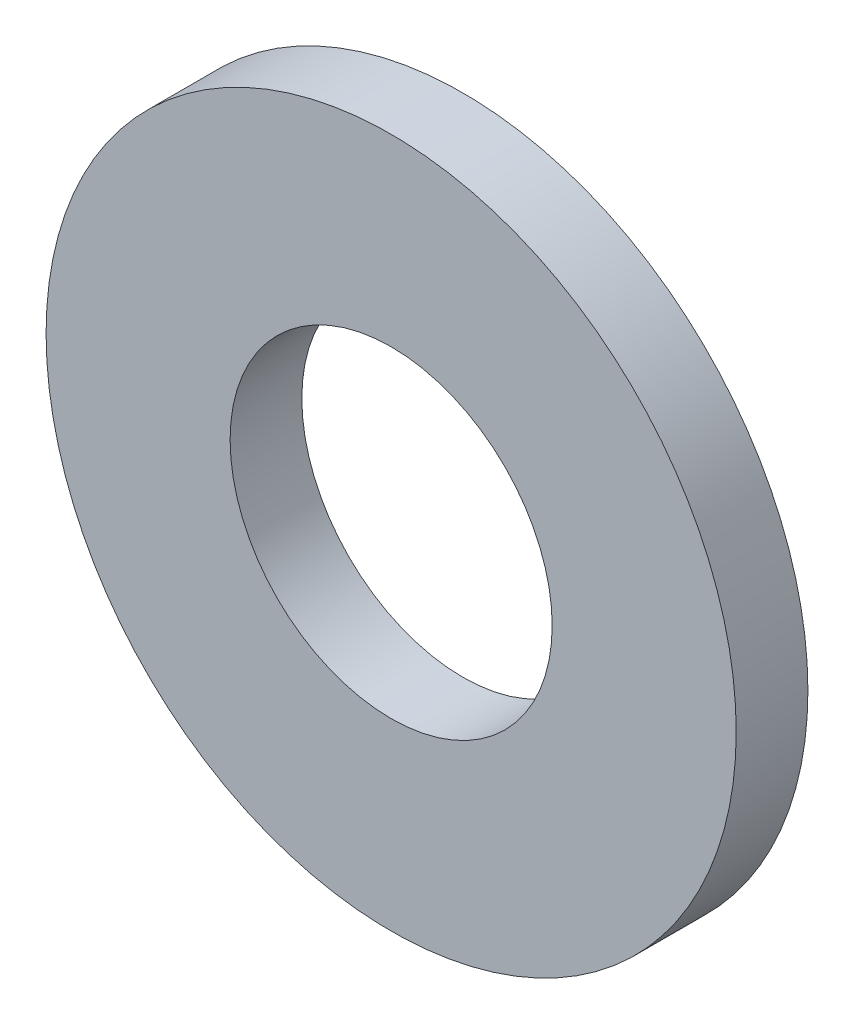
ISO-10303-21;
HEADER;
FILE_DESCRIPTION(('STEP AP214'),'2;1');
FILE_NAME('part.step','',(''),(''),'','','');
FILE_SCHEMA(('AUTOMOTIVE_DESIGN { 1 0 10303 214 1 1 1 1 }'));
ENDSEC;
DATA;
#1=APPLICATION_CONTEXT('core data for automotive mechanical design processes');
#2=APPLICATION_PROTOCOL_DEFINITION('international standard','automotive_design',2000,#1);
#3=PRODUCT_CONTEXT('',#1,'mechanical');
#4=PRODUCT('Part','Part','',(#3));
#5=PRODUCT_RELATED_PRODUCT_CATEGORY('part','',(#4));
#6=PRODUCT_DEFINITION_FORMATION('','',#4);
#7=PRODUCT_DEFINITION_CONTEXT('part definition',#1,'design');
#8=PRODUCT_DEFINITION('design','',#6,#7);
#9=PRODUCT_DEFINITION_SHAPE('','',#8);
#10=(LENGTH_UNIT() NAMED_UNIT(*) SI_UNIT(.MILLI.,.METRE.));
#11=(NAMED_UNIT(*) PLANE_ANGLE_UNIT() SI_UNIT($,.RADIAN.));
#12=(NAMED_UNIT(*) SI_UNIT($,.STERADIAN.) SOLID_ANGLE_UNIT());
#13=UNCERTAINTY_MEASURE_WITH_UNIT(LENGTH_MEASURE(1.E-05),#10,'distance_accuracy_value','');
#14=(GEOMETRIC_REPRESENTATION_CONTEXT(3) GLOBAL_UNCERTAINTY_ASSIGNED_CONTEXT((#13)) GLOBAL_UNIT_ASSIGNED_CONTEXT((#10,
#11,#12)) REPRESENTATION_CONTEXT('',''));
#15=CARTESIAN_POINT('',(0.,0.,0.));
#16=DIRECTION('',(0.,0.,1.));
#17=DIRECTION('',(1.,0.,0.));
#18=AXIS2_PLACEMENT_3D('',#15,#16,#17);
#19=CARTESIAN_POINT('',(0.,0.,-1.87));
#20=DIRECTION('',(0.,0.,1.));
#21=DIRECTION('',(1.,0.,0.));
#22=AXIS2_PLACEMENT_3D('',#19,#20,#21);
#23=CYLINDRICAL_SURFACE('',#22,9.);
#24=CARTESIAN_POINT('',(0.,0.,-1.87));
#25=DIRECTION('',(0.,0.,1.));
#26=DIRECTION('',(1.,0.,0.));
#27=AXIS2_PLACEMENT_3D('',#24,#25,#26);
#28=CIRCLE('',#27,9.);
#29=CARTESIAN_POINT('',(9.,0.,-1.87));
#30=VERTEX_POINT('',#29);
#31=EDGE_CURVE('E10',#30,#30,#28,.T.);
#32=ORIENTED_EDGE('',*,*,#31,.T.);
#33=EDGE_LOOP('',(#32));
#34=FACE_BOUND('',#33,.T.);
#35=CARTESIAN_POINT('',(0.,0.,0.));
#36=DIRECTION('',(0.,0.,1.));
#37=DIRECTION('',(1.,0.,0.));
#38=AXIS2_PLACEMENT_3D('',#35,#36,#37);
#39=CIRCLE('',#38,9.);
#40=CARTESIAN_POINT('',(9.,0.,0.));
#41=VERTEX_POINT('',#40);
#42=EDGE_CURVE('E33',#41,#41,#39,.T.);
#43=ORIENTED_EDGE('',*,*,#42,.F.);
#44=EDGE_LOOP('',(#43));
#45=FACE_BOUND('',#44,.T.);
#46=ADVANCED_FACE('F30',(#34,#45),#23,.T.);
#47=CARTESIAN_POINT('',(0.,0.,-1.87));
#48=DIRECTION('',(0.,0.,1.));
#49=DIRECTION('',(1.,0.,0.));
#50=AXIS2_PLACEMENT_3D('',#47,#48,#49);
#51=PLANE('',#50);
#52=CARTESIAN_POINT('',(0.,0.,-1.87));
#53=DIRECTION('',(0.,0.,1.));
#54=DIRECTION('',(1.,0.,0.));
#55=AXIS2_PLACEMENT_3D('',#52,#53,#54);
#56=CIRCLE('',#55,4.2);
#57=CARTESIAN_POINT('',(4.2,0.,-1.87));
#58=VERTEX_POINT('',#57);
#59=EDGE_CURVE('E40',#58,#58,#56,.T.);
#60=ORIENTED_EDGE('',*,*,#59,.T.);
#61=EDGE_LOOP('',(#60));
#62=FACE_BOUND('',#61,.T.);
#63=ORIENTED_EDGE('',*,*,#31,.F.);
#64=EDGE_LOOP('',(#63));
#65=FACE_BOUND('',#64,.T.);
#66=ADVANCED_FACE('F48',(#62,#65),#51,.F.);
#67=CARTESIAN_POINT('',(0.,0.,0.));
#68=DIRECTION('',(0.,0.,1.));
#69=DIRECTION('',(1.,0.,0.));
#70=AXIS2_PLACEMENT_3D('',#67,#68,#69);
#71=PLANE('',#70);
#72=CARTESIAN_POINT('',(0.,0.,0.));
#73=DIRECTION('',(0.,0.,1.));
#74=DIRECTION('',(1.,0.,0.));
#75=AXIS2_PLACEMENT_3D('',#72,#73,#74);
#76=CIRCLE('',#75,4.2);
#77=CARTESIAN_POINT('',(4.2,0.,0.));
#78=VERTEX_POINT('',#77);
#79=EDGE_CURVE('E42',#78,#78,#76,.T.);
#80=ORIENTED_EDGE('',*,*,#79,.F.);
#81=EDGE_LOOP('',(#80));
#82=FACE_BOUND('',#81,.T.);
#83=ORIENTED_EDGE('',*,*,#42,.T.);
#84=EDGE_LOOP('',(#83));
#85=FACE_BOUND('',#84,.T.);
#86=ADVANCED_FACE('F54',(#82,#85),#71,.T.);
#87=CARTESIAN_POINT('',(0.,0.,-1.87));
#88=DIRECTION('',(0.,0.,1.));
#89=DIRECTION('',(1.,0.,0.));
#90=AXIS2_PLACEMENT_3D('',#87,#88,#89);
#91=CYLINDRICAL_SURFACE('',#90,4.2);
#92=ORIENTED_EDGE('',*,*,#59,.F.);
#93=EDGE_LOOP('',(#92));
#94=FACE_BOUND('',#93,.T.);
#95=ORIENTED_EDGE('',*,*,#79,.T.);
#96=EDGE_LOOP('',(#95));
#97=FACE_BOUND('',#96,.T.);
#98=ADVANCED_FACE('F51',(#94,#97),#91,.F.);
#99=CLOSED_SHELL('',(#46,#66,#86,#98));
#100=MANIFOLD_SOLID_BREP('B2',#99);
#101=ADVANCED_BREP_SHAPE_REPRESENTATION('',(#18,#100),#14);
#102=SHAPE_DEFINITION_REPRESENTATION(#9,#101);
ENDSEC;
END-ISO-10303-21;
